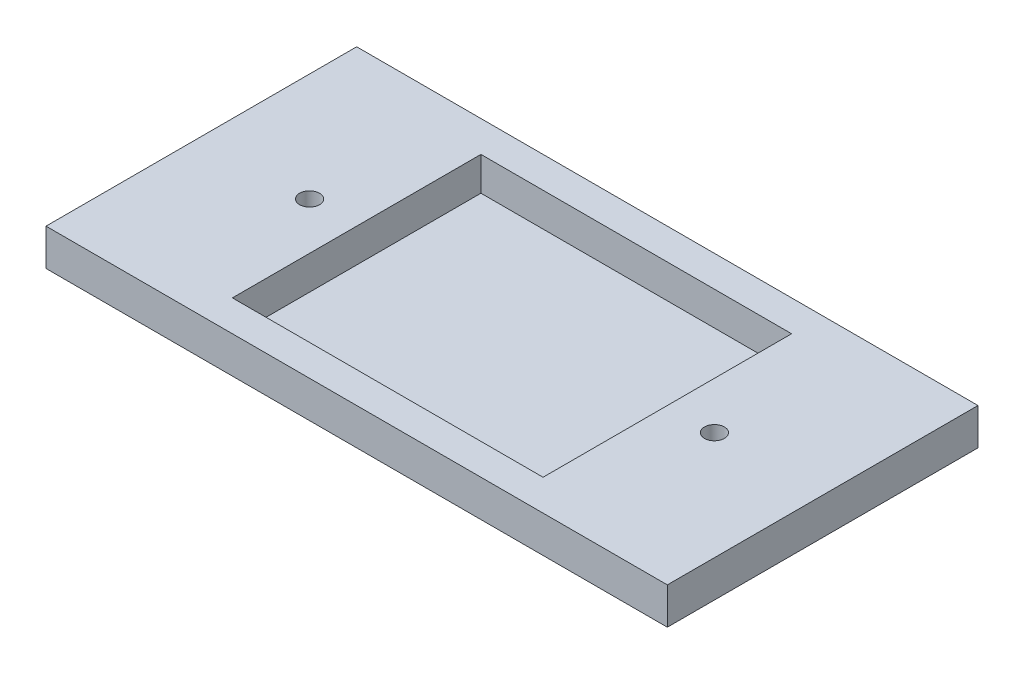
ISO-10303-21;
HEADER;
FILE_DESCRIPTION(('STEP AP214'),'2;1');
FILE_NAME('part.step','',(''),(''),'','','');
FILE_SCHEMA(('AUTOMOTIVE_DESIGN { 1 0 10303 214 1 1 1 1 }'));
ENDSEC;
DATA;
#1=APPLICATION_CONTEXT('core data for automotive mechanical design processes');
#2=APPLICATION_PROTOCOL_DEFINITION('international standard','automotive_design',2000,#1);
#3=PRODUCT_CONTEXT('',#1,'mechanical');
#4=PRODUCT('Part','Part','',(#3));
#5=PRODUCT_RELATED_PRODUCT_CATEGORY('part','',(#4));
#6=PRODUCT_DEFINITION_FORMATION('','',#4);
#7=PRODUCT_DEFINITION_CONTEXT('part definition',#1,'design');
#8=PRODUCT_DEFINITION('design','',#6,#7);
#9=PRODUCT_DEFINITION_SHAPE('','',#8);
#10=(LENGTH_UNIT() NAMED_UNIT(*) SI_UNIT(.MILLI.,.METRE.));
#11=(NAMED_UNIT(*) PLANE_ANGLE_UNIT() SI_UNIT($,.RADIAN.));
#12=(NAMED_UNIT(*) SI_UNIT($,.STERADIAN.) SOLID_ANGLE_UNIT());
#13=UNCERTAINTY_MEASURE_WITH_UNIT(LENGTH_MEASURE(1.E-05),#10,'distance_accuracy_value','');
#14=(GEOMETRIC_REPRESENTATION_CONTEXT(3) GLOBAL_UNCERTAINTY_ASSIGNED_CONTEXT((#13)) GLOBAL_UNIT_ASSIGNED_CONTEXT((#10,
#11,#12)) REPRESENTATION_CONTEXT('',''));
#15=CARTESIAN_POINT('',(0.,0.,0.));
#16=DIRECTION('',(0.,0.,1.));
#17=DIRECTION('',(1.,0.,0.));
#18=AXIS2_PLACEMENT_3D('',#15,#16,#17);
#19=CARTESIAN_POINT('',(50.8,6.,25.4));
#20=DIRECTION('',(-1.,0.,0.));
#21=DIRECTION('',(0.,0.,1.));
#22=AXIS2_PLACEMENT_3D('',#19,#20,#21);
#23=PLANE('',#22);
#24=DIRECTION('',(0.,0.,-1.));
#25=VECTOR('',#24,1.);
#26=CARTESIAN_POINT('',(50.8,0.,25.4));
#27=LINE('',#26,#25);
#28=CARTESIAN_POINT('',(50.8,0.,25.4));
#29=VERTEX_POINT('',#28);
#30=CARTESIAN_POINT('',(50.8,0.,-25.4));
#31=VERTEX_POINT('',#30);
#32=EDGE_CURVE('E145',#29,#31,#27,.T.);
#33=ORIENTED_EDGE('',*,*,#32,.T.);
#34=DIRECTION('',(0.,-1.,0.));
#35=VECTOR('',#34,1.);
#36=CARTESIAN_POINT('',(50.8,6.,-25.4));
#37=LINE('',#36,#35);
#38=CARTESIAN_POINT('',(50.8,6.,-25.4));
#39=VERTEX_POINT('',#38);
#40=EDGE_CURVE('E11',#39,#31,#37,.T.);
#41=ORIENTED_EDGE('',*,*,#40,.F.);
#42=DIRECTION('',(0.,0.,-1.));
#43=VECTOR('',#42,1.);
#44=CARTESIAN_POINT('',(50.8,6.,25.4));
#45=LINE('',#44,#43);
#46=CARTESIAN_POINT('',(50.8,6.,25.4));
#47=VERTEX_POINT('',#46);
#48=EDGE_CURVE('E149',#47,#39,#45,.T.);
#49=ORIENTED_EDGE('',*,*,#48,.F.);
#50=DIRECTION('',(0.,-1.,0.));
#51=VECTOR('',#50,1.);
#52=CARTESIAN_POINT('',(50.8,6.,25.4));
#53=LINE('',#52,#51);
#54=EDGE_CURVE('E155',#47,#29,#53,.T.);
#55=ORIENTED_EDGE('',*,*,#54,.T.);
#56=EDGE_LOOP('',(#33,#41,#49,#55));
#57=FACE_BOUND('',#56,.T.);
#58=ADVANCED_FACE('F33',(#57),#23,.F.);
#59=CARTESIAN_POINT('',(-50.8,6.,-25.4));
#60=DIRECTION('',(0.,0.,1.));
#61=DIRECTION('',(1.,0.,0.));
#62=AXIS2_PLACEMENT_3D('',#59,#60,#61);
#63=PLANE('',#62);
#64=DIRECTION('',(-1.,0.,0.));
#65=VECTOR('',#64,1.);
#66=CARTESIAN_POINT('',(-50.8,0.,-25.4));
#67=LINE('',#66,#65);
#68=CARTESIAN_POINT('',(-50.8,0.,-25.4));
#69=VERTEX_POINT('',#68);
#70=EDGE_CURVE('E158',#31,#69,#67,.T.);
#71=ORIENTED_EDGE('',*,*,#70,.T.);
#72=DIRECTION('',(0.,-1.,0.));
#73=VECTOR('',#72,1.);
#74=CARTESIAN_POINT('',(-50.8,6.,-25.4));
#75=LINE('',#74,#73);
#76=CARTESIAN_POINT('',(-50.8,6.,-25.4));
#77=VERTEX_POINT('',#76);
#78=EDGE_CURVE('E40',#77,#69,#75,.T.);
#79=ORIENTED_EDGE('',*,*,#78,.F.);
#80=DIRECTION('',(-1.,0.,0.));
#81=VECTOR('',#80,1.);
#82=CARTESIAN_POINT('',(-50.8,6.,-25.4));
#83=LINE('',#82,#81);
#84=EDGE_CURVE('E84',#39,#77,#83,.T.);
#85=ORIENTED_EDGE('',*,*,#84,.F.);
#86=ORIENTED_EDGE('',*,*,#40,.T.);
#87=EDGE_LOOP('',(#71,#79,#85,#86));
#88=FACE_BOUND('',#87,.T.);
#89=ADVANCED_FACE('F187',(#88),#63,.F.);
#90=CARTESIAN_POINT('',(-50.8,6.,25.4));
#91=DIRECTION('',(1.,0.,0.));
#92=DIRECTION('',(0.,0.,-1.));
#93=AXIS2_PLACEMENT_3D('',#90,#91,#92);
#94=PLANE('',#93);
#95=DIRECTION('',(0.,0.,1.));
#96=VECTOR('',#95,1.);
#97=CARTESIAN_POINT('',(-50.8,0.,25.4));
#98=LINE('',#97,#96);
#99=CARTESIAN_POINT('',(-50.8,0.,25.4));
#100=VERTEX_POINT('',#99);
#101=EDGE_CURVE('E160',#69,#100,#98,.T.);
#102=ORIENTED_EDGE('',*,*,#101,.T.);
#103=DIRECTION('',(0.,-1.,0.));
#104=VECTOR('',#103,1.);
#105=CARTESIAN_POINT('',(-50.8,6.,25.4));
#106=LINE('',#105,#104);
#107=CARTESIAN_POINT('',(-50.8,6.,25.4));
#108=VERTEX_POINT('',#107);
#109=EDGE_CURVE('E164',#108,#100,#106,.T.);
#110=ORIENTED_EDGE('',*,*,#109,.F.);
#111=DIRECTION('',(0.,0.,1.));
#112=VECTOR('',#111,1.);
#113=CARTESIAN_POINT('',(-50.8,6.,25.4));
#114=LINE('',#113,#112);
#115=EDGE_CURVE('E152',#77,#108,#114,.T.);
#116=ORIENTED_EDGE('',*,*,#115,.F.);
#117=ORIENTED_EDGE('',*,*,#78,.T.);
#118=EDGE_LOOP('',(#102,#110,#116,#117));
#119=FACE_BOUND('',#118,.T.);
#120=ADVANCED_FACE('F169',(#119),#94,.F.);
#121=CARTESIAN_POINT('',(-50.8,6.,25.4));
#122=DIRECTION('',(0.,0.,-1.));
#123=DIRECTION('',(-1.,0.,0.));
#124=AXIS2_PLACEMENT_3D('',#121,#122,#123);
#125=PLANE('',#124);
#126=DIRECTION('',(1.,0.,0.));
#127=VECTOR('',#126,1.);
#128=CARTESIAN_POINT('',(-50.8,0.,25.4));
#129=LINE('',#128,#127);
#130=EDGE_CURVE('E77',#100,#29,#129,.T.);
#131=ORIENTED_EDGE('',*,*,#130,.T.);
#132=ORIENTED_EDGE('',*,*,#54,.F.);
#133=DIRECTION('',(1.,0.,0.));
#134=VECTOR('',#133,1.);
#135=CARTESIAN_POINT('',(-50.8,6.,25.4));
#136=LINE('',#135,#134);
#137=EDGE_CURVE('E56',#108,#47,#136,.T.);
#138=ORIENTED_EDGE('',*,*,#137,.F.);
#139=ORIENTED_EDGE('',*,*,#109,.T.);
#140=EDGE_LOOP('',(#131,#132,#138,#139));
#141=FACE_BOUND('',#140,.T.);
#142=ADVANCED_FACE('F177',(#141),#125,.F.);
#143=CARTESIAN_POINT('',(0.,6.,0.));
#144=DIRECTION('',(0.,-1.,0.));
#145=DIRECTION('',(0.,0.,-1.));
#146=AXIS2_PLACEMENT_3D('',#143,#144,#145);
#147=PLANE('',#146);
#148=CARTESIAN_POINT('',(33.1,6.,0.));
#149=DIRECTION('',(0.,1.,0.));
#150=DIRECTION('',(0.,0.,1.));
#151=AXIS2_PLACEMENT_3D('',#148,#149,#150);
#152=CIRCLE('',#151,1.63195);
#153=CARTESIAN_POINT('',(33.1,6.,1.63195));
#154=VERTEX_POINT('',#153);
#155=EDGE_CURVE('E292',#154,#154,#152,.T.);
#156=ORIENTED_EDGE('',*,*,#155,.F.);
#157=EDGE_LOOP('',(#156));
#158=FACE_BOUND('',#157,.T.);
#159=CARTESIAN_POINT('',(-33.1,6.,0.));
#160=DIRECTION('',(0.,1.,0.));
#161=DIRECTION('',(0.,0.,1.));
#162=AXIS2_PLACEMENT_3D('',#159,#160,#161);
#163=CIRCLE('',#162,1.63195);
#164=CARTESIAN_POINT('',(-33.1,6.,1.63195));
#165=VERTEX_POINT('',#164);
#166=EDGE_CURVE('E132',#165,#165,#163,.T.);
#167=ORIENTED_EDGE('',*,*,#166,.F.);
#168=EDGE_LOOP('',(#167));
#169=FACE_BOUND('',#168,.T.);
#170=DIRECTION('',(-1.,0.,0.));
#171=VECTOR('',#170,1.);
#172=CARTESIAN_POINT('',(-25.4,6.,-20.32));
#173=LINE('',#172,#171);
#174=CARTESIAN_POINT('',(25.4,6.,-20.32));
#175=VERTEX_POINT('',#174);
#176=CARTESIAN_POINT('',(-25.4,6.,-20.32));
#177=VERTEX_POINT('',#176);
#178=EDGE_CURVE('E138',#175,#177,#173,.T.);
#179=ORIENTED_EDGE('',*,*,#178,.F.);
#180=DIRECTION('',(0.,0.,-1.));
#181=VECTOR('',#180,1.);
#182=CARTESIAN_POINT('',(25.4,6.,20.32));
#183=LINE('',#182,#181);
#184=CARTESIAN_POINT('',(25.4,6.,20.32));
#185=VERTEX_POINT('',#184);
#186=EDGE_CURVE('E47',#185,#175,#183,.T.);
#187=ORIENTED_EDGE('',*,*,#186,.F.);
#188=DIRECTION('',(1.,0.,0.));
#189=VECTOR('',#188,1.);
#190=CARTESIAN_POINT('',(-25.4,6.,20.32));
#191=LINE('',#190,#189);
#192=CARTESIAN_POINT('',(-25.4,6.,20.32));
#193=VERTEX_POINT('',#192);
#194=EDGE_CURVE('E126',#193,#185,#191,.T.);
#195=ORIENTED_EDGE('',*,*,#194,.F.);
#196=DIRECTION('',(0.,0.,1.));
#197=VECTOR('',#196,1.);
#198=CARTESIAN_POINT('',(-25.4,6.,20.32));
#199=LINE('',#198,#197);
#200=EDGE_CURVE('E129',#177,#193,#199,.T.);
#201=ORIENTED_EDGE('',*,*,#200,.F.);
#202=EDGE_LOOP('',(#179,#187,#195,#201));
#203=FACE_BOUND('',#202,.T.);
#204=ORIENTED_EDGE('',*,*,#48,.T.);
#205=ORIENTED_EDGE('',*,*,#84,.T.);
#206=ORIENTED_EDGE('',*,*,#115,.T.);
#207=ORIENTED_EDGE('',*,*,#137,.T.);
#208=EDGE_LOOP('',(#204,#205,#206,#207));
#209=FACE_BOUND('',#208,.T.);
#210=ADVANCED_FACE('F179',(#158,#169,#203,#209),#147,.F.);
#211=CARTESIAN_POINT('',(0.,0.,0.));
#212=DIRECTION('',(0.,-1.,0.));
#213=DIRECTION('',(0.,0.,-1.));
#214=AXIS2_PLACEMENT_3D('',#211,#212,#213);
#215=PLANE('',#214);
#216=CARTESIAN_POINT('',(33.1,0.,0.));
#217=DIRECTION('',(0.,1.,0.));
#218=DIRECTION('',(0.,0.,1.));
#219=AXIS2_PLACEMENT_3D('',#216,#217,#218);
#220=CIRCLE('',#219,1.63195);
#221=CARTESIAN_POINT('',(33.1,0.,1.63195));
#222=VERTEX_POINT('',#221);
#223=EDGE_CURVE('E289',#222,#222,#220,.T.);
#224=ORIENTED_EDGE('',*,*,#223,.T.);
#225=EDGE_LOOP('',(#224));
#226=FACE_BOUND('',#225,.T.);
#227=CARTESIAN_POINT('',(-33.1,0.,0.));
#228=DIRECTION('',(0.,1.,0.));
#229=DIRECTION('',(0.,0.,1.));
#230=AXIS2_PLACEMENT_3D('',#227,#228,#229);
#231=CIRCLE('',#230,1.63195);
#232=CARTESIAN_POINT('',(-33.1,0.,1.63195));
#233=VERTEX_POINT('',#232);
#234=EDGE_CURVE('E139',#233,#233,#231,.T.);
#235=ORIENTED_EDGE('',*,*,#234,.T.);
#236=EDGE_LOOP('',(#235));
#237=FACE_BOUND('',#236,.T.);
#238=ORIENTED_EDGE('',*,*,#32,.F.);
#239=ORIENTED_EDGE('',*,*,#130,.F.);
#240=ORIENTED_EDGE('',*,*,#101,.F.);
#241=ORIENTED_EDGE('',*,*,#70,.F.);
#242=EDGE_LOOP('',(#238,#239,#240,#241));
#243=FACE_BOUND('',#242,.T.);
#244=ADVANCED_FACE('F173',(#226,#237,#243),#215,.T.);
#245=CARTESIAN_POINT('',(25.4,0.5,20.32));
#246=DIRECTION('',(1.,0.,0.));
#247=DIRECTION('',(0.,0.,-1.));
#248=AXIS2_PLACEMENT_3D('',#245,#246,#247);
#249=PLANE('',#248);
#250=ORIENTED_EDGE('',*,*,#186,.T.);
#251=DIRECTION('',(0.,1.,0.));
#252=VECTOR('',#251,1.);
#253=CARTESIAN_POINT('',(25.4,0.5,-20.32));
#254=LINE('',#253,#252);
#255=CARTESIAN_POINT('',(25.4,0.5,-20.32));
#256=VERTEX_POINT('',#255);
#257=EDGE_CURVE('E104',#256,#175,#254,.T.);
#258=ORIENTED_EDGE('',*,*,#257,.F.);
#259=DIRECTION('',(0.,0.,-1.));
#260=VECTOR('',#259,1.);
#261=CARTESIAN_POINT('',(25.4,0.5,20.32));
#262=LINE('',#261,#260);
#263=CARTESIAN_POINT('',(25.4,0.5,20.32));
#264=VERTEX_POINT('',#263);
#265=EDGE_CURVE('E108',#264,#256,#262,.T.);
#266=ORIENTED_EDGE('',*,*,#265,.F.);
#267=DIRECTION('',(0.,1.,0.));
#268=VECTOR('',#267,1.);
#269=CARTESIAN_POINT('',(25.4,0.5,20.32));
#270=LINE('',#269,#268);
#271=EDGE_CURVE('E143',#264,#185,#270,.T.);
#272=ORIENTED_EDGE('',*,*,#271,.T.);
#273=EDGE_LOOP('',(#250,#258,#266,#272));
#274=FACE_BOUND('',#273,.T.);
#275=ADVANCED_FACE('F106',(#274),#249,.F.);
#276=CARTESIAN_POINT('',(-25.4,0.5,20.32));
#277=DIRECTION('',(0.,0.,1.));
#278=DIRECTION('',(1.,0.,0.));
#279=AXIS2_PLACEMENT_3D('',#276,#277,#278);
#280=PLANE('',#279);
#281=ORIENTED_EDGE('',*,*,#194,.T.);
#282=ORIENTED_EDGE('',*,*,#271,.F.);
#283=DIRECTION('',(1.,0.,0.));
#284=VECTOR('',#283,1.);
#285=CARTESIAN_POINT('',(-25.4,0.5,20.32));
#286=LINE('',#285,#284);
#287=CARTESIAN_POINT('',(-25.4,0.5,20.32));
#288=VERTEX_POINT('',#287);
#289=EDGE_CURVE('E114',#288,#264,#286,.T.);
#290=ORIENTED_EDGE('',*,*,#289,.F.);
#291=DIRECTION('',(0.,1.,0.));
#292=VECTOR('',#291,1.);
#293=CARTESIAN_POINT('',(-25.4,0.5,20.32));
#294=LINE('',#293,#292);
#295=EDGE_CURVE('E146',#288,#193,#294,.T.);
#296=ORIENTED_EDGE('',*,*,#295,.T.);
#297=EDGE_LOOP('',(#281,#282,#290,#296));
#298=FACE_BOUND('',#297,.T.);
#299=ADVANCED_FACE('F214',(#298),#280,.F.);
#300=CARTESIAN_POINT('',(-25.4,0.5,20.32));
#301=DIRECTION('',(-1.,0.,0.));
#302=DIRECTION('',(0.,0.,1.));
#303=AXIS2_PLACEMENT_3D('',#300,#301,#302);
#304=PLANE('',#303);
#305=ORIENTED_EDGE('',*,*,#200,.T.);
#306=ORIENTED_EDGE('',*,*,#295,.F.);
#307=DIRECTION('',(0.,0.,1.));
#308=VECTOR('',#307,1.);
#309=CARTESIAN_POINT('',(-25.4,0.5,20.32));
#310=LINE('',#309,#308);
#311=CARTESIAN_POINT('',(-25.4,0.5,-20.32));
#312=VERTEX_POINT('',#311);
#313=EDGE_CURVE('E122',#312,#288,#310,.T.);
#314=ORIENTED_EDGE('',*,*,#313,.F.);
#315=DIRECTION('',(0.,1.,0.));
#316=VECTOR('',#315,1.);
#317=CARTESIAN_POINT('',(-25.4,0.5,-20.32));
#318=LINE('',#317,#316);
#319=EDGE_CURVE('E113',#312,#177,#318,.T.);
#320=ORIENTED_EDGE('',*,*,#319,.T.);
#321=EDGE_LOOP('',(#305,#306,#314,#320));
#322=FACE_BOUND('',#321,.T.);
#323=ADVANCED_FACE('F225',(#322),#304,.F.);
#324=CARTESIAN_POINT('',(-25.4,0.5,-20.32));
#325=DIRECTION('',(0.,0.,-1.));
#326=DIRECTION('',(-1.,0.,0.));
#327=AXIS2_PLACEMENT_3D('',#324,#325,#326);
#328=PLANE('',#327);
#329=ORIENTED_EDGE('',*,*,#178,.T.);
#330=ORIENTED_EDGE('',*,*,#319,.F.);
#331=DIRECTION('',(-1.,0.,0.));
#332=VECTOR('',#331,1.);
#333=CARTESIAN_POINT('',(-25.4,0.5,-20.32));
#334=LINE('',#333,#332);
#335=EDGE_CURVE('E117',#256,#312,#334,.T.);
#336=ORIENTED_EDGE('',*,*,#335,.F.);
#337=ORIENTED_EDGE('',*,*,#257,.T.);
#338=EDGE_LOOP('',(#329,#330,#336,#337));
#339=FACE_BOUND('',#338,.T.);
#340=ADVANCED_FACE('F118',(#339),#328,.F.);
#341=CARTESIAN_POINT('',(0.,0.5,0.));
#342=DIRECTION('',(0.,-1.,0.));
#343=DIRECTION('',(0.,0.,-1.));
#344=AXIS2_PLACEMENT_3D('',#341,#342,#343);
#345=PLANE('',#344);
#346=ORIENTED_EDGE('',*,*,#265,.T.);
#347=ORIENTED_EDGE('',*,*,#335,.T.);
#348=ORIENTED_EDGE('',*,*,#313,.T.);
#349=ORIENTED_EDGE('',*,*,#289,.T.);
#350=EDGE_LOOP('',(#346,#347,#348,#349));
#351=FACE_BOUND('',#350,.T.);
#352=ADVANCED_FACE('F124',(#351),#345,.F.);
#353=CARTESIAN_POINT('',(-33.1,0.,0.));
#354=DIRECTION('',(0.,1.,0.));
#355=DIRECTION('',(0.,0.,1.));
#356=AXIS2_PLACEMENT_3D('',#353,#354,#355);
#357=CYLINDRICAL_SURFACE('',#356,1.63195);
#358=ORIENTED_EDGE('',*,*,#234,.F.);
#359=EDGE_LOOP('',(#358));
#360=FACE_BOUND('',#359,.T.);
#361=ORIENTED_EDGE('',*,*,#166,.T.);
#362=EDGE_LOOP('',(#361));
#363=FACE_BOUND('',#362,.T.);
#364=ADVANCED_FACE('F252',(#360,#363),#357,.F.);
#365=CARTESIAN_POINT('',(33.1,0.,0.));
#366=DIRECTION('',(0.,1.,0.));
#367=DIRECTION('',(0.,0.,1.));
#368=AXIS2_PLACEMENT_3D('',#365,#366,#367);
#369=CYLINDRICAL_SURFACE('',#368,1.63195);
#370=ORIENTED_EDGE('',*,*,#223,.F.);
#371=EDGE_LOOP('',(#370));
#372=FACE_BOUND('',#371,.T.);
#373=ORIENTED_EDGE('',*,*,#155,.T.);
#374=EDGE_LOOP('',(#373));
#375=FACE_BOUND('',#374,.T.);
#376=ADVANCED_FACE('F261',(#372,#375),#369,.F.);
#377=CLOSED_SHELL('',(#58,#89,#120,#142,#210,#244,#275,#299,#323,#340,#352,#364,#376));
#378=MANIFOLD_SOLID_BREP('B2',#377);
#379=ADVANCED_BREP_SHAPE_REPRESENTATION('',(#18,#378),#14);
#380=SHAPE_DEFINITION_REPRESENTATION(#9,#379);
ENDSEC;
END-ISO-10303-21;
